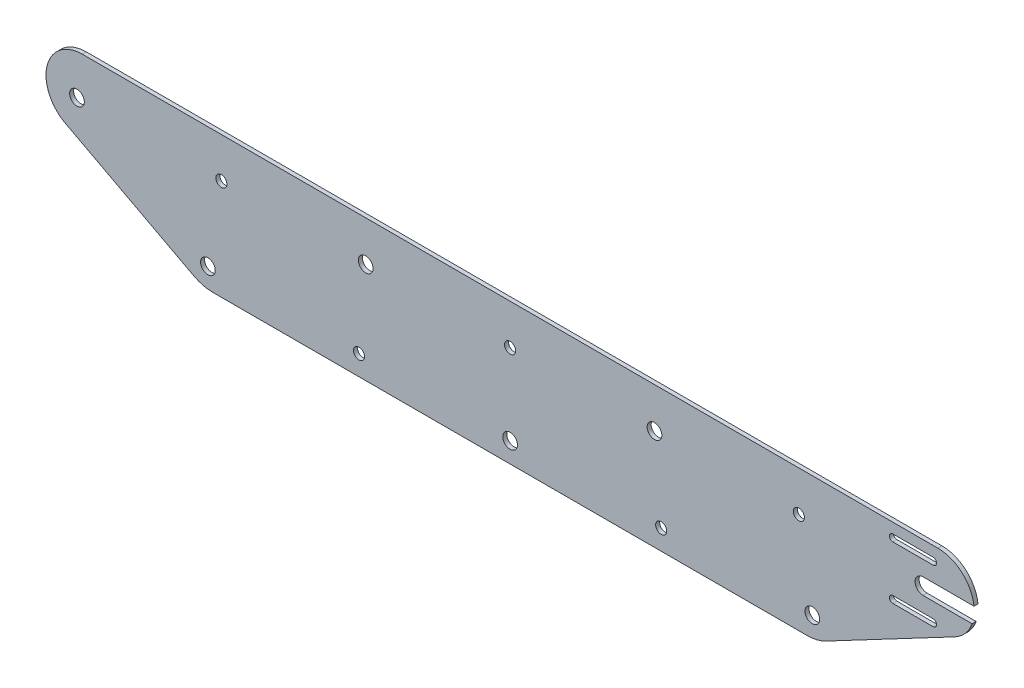
ISO-10303-21;
HEADER;
FILE_DESCRIPTION(('STEP AP214'),'2;1');
FILE_NAME('part.step','',(''),(''),'','','');
FILE_SCHEMA(('AUTOMOTIVE_DESIGN { 1 0 10303 214 1 1 1 1 }'));
ENDSEC;
DATA;
#1=APPLICATION_CONTEXT('core data for automotive mechanical design processes');
#2=APPLICATION_PROTOCOL_DEFINITION('international standard','automotive_design',2000,#1);
#3=PRODUCT_CONTEXT('',#1,'mechanical');
#4=PRODUCT('Part','Part','',(#3));
#5=PRODUCT_RELATED_PRODUCT_CATEGORY('part','',(#4));
#6=PRODUCT_DEFINITION_FORMATION('','',#4);
#7=PRODUCT_DEFINITION_CONTEXT('part definition',#1,'design');
#8=PRODUCT_DEFINITION('design','',#6,#7);
#9=PRODUCT_DEFINITION_SHAPE('','',#8);
#10=(LENGTH_UNIT() NAMED_UNIT(*) SI_UNIT(.MILLI.,.METRE.));
#11=(NAMED_UNIT(*) PLANE_ANGLE_UNIT() SI_UNIT($,.RADIAN.));
#12=(NAMED_UNIT(*) SI_UNIT($,.STERADIAN.) SOLID_ANGLE_UNIT());
#13=UNCERTAINTY_MEASURE_WITH_UNIT(LENGTH_MEASURE(1.E-05),#10,'distance_accuracy_value','');
#14=(GEOMETRIC_REPRESENTATION_CONTEXT(3) GLOBAL_UNCERTAINTY_ASSIGNED_CONTEXT((#13)) GLOBAL_UNIT_ASSIGNED_CONTEXT((#10,
#11,#12)) REPRESENTATION_CONTEXT('',''));
#15=CARTESIAN_POINT('',(0.,0.,0.));
#16=DIRECTION('',(0.,0.,1.));
#17=DIRECTION('',(1.,0.,0.));
#18=AXIS2_PLACEMENT_3D('',#15,#16,#17);
#19=CARTESIAN_POINT('',(212.363587037175,22.0000000000002,2.));
#20=DIRECTION('',(0.,0.,-1.));
#21=DIRECTION('',(-1.,0.,0.));
#22=AXIS2_PLACEMENT_3D('',#19,#20,#21);
#23=CYLINDRICAL_SURFACE('',#22,18.);
#24=CARTESIAN_POINT('',(212.363587037175,22.0000000000002,0.));
#25=DIRECTION('',(0.,0.,-1.));
#26=DIRECTION('',(-1.,0.,0.));
#27=AXIS2_PLACEMENT_3D('',#24,#25,#26);
#28=CIRCLE('',#27,18.);
#29=CARTESIAN_POINT('',(229.334149785652,16.,0.));
#30=VERTEX_POINT('',#29);
#31=CARTESIAN_POINT('',(220.772782979187,6.08505659423059,0.));
#32=VERTEX_POINT('',#31);
#33=EDGE_CURVE('E391',#30,#32,#28,.T.);
#34=ORIENTED_EDGE('',*,*,#33,.F.);
#35=DIRECTION('',(0.,0.,-1.));
#36=VECTOR('',#35,1.);
#37=CARTESIAN_POINT('',(229.334149785652,16.,2.));
#38=LINE('',#37,#36);
#39=CARTESIAN_POINT('',(229.334149785652,16.,2.));
#40=VERTEX_POINT('',#39);
#41=EDGE_CURVE('E319',#40,#30,#38,.T.);
#42=ORIENTED_EDGE('',*,*,#41,.F.);
#43=CARTESIAN_POINT('',(212.363587037175,22.0000000000002,2.));
#44=DIRECTION('',(0.,0.,-1.));
#45=DIRECTION('',(-1.,0.,0.));
#46=AXIS2_PLACEMENT_3D('',#43,#44,#45);
#47=CIRCLE('',#46,18.);
#48=CARTESIAN_POINT('',(220.772782979187,6.08505659423059,2.));
#49=VERTEX_POINT('',#48);
#50=EDGE_CURVE('E401',#49,#40,#47,.F.);
#51=ORIENTED_EDGE('',*,*,#50,.F.);
#52=DIRECTION('',(0.,0.,-1.));
#53=VECTOR('',#52,1.);
#54=CARTESIAN_POINT('',(220.772782979187,6.08505659423059,2.));
#55=LINE('',#54,#53);
#56=EDGE_CURVE('E395',#32,#49,#55,.F.);
#57=ORIENTED_EDGE('',*,*,#56,.F.);
#58=EDGE_LOOP('',(#34,#42,#51,#57));
#59=FACE_BOUND('',#58,.T.);
#60=ADVANCED_FACE('F87',(#59),#23,.T.);
#61=CARTESIAN_POINT('',(0.,0.,2.));
#62=DIRECTION('',(0.,0.,-1.));
#63=DIRECTION('',(-1.,0.,0.));
#64=AXIS2_PLACEMENT_3D('',#61,#62,#63);
#65=PLANE('',#64);
#66=CARTESIAN_POINT('',(-74.9999999999999,-20.,2.));
#67=DIRECTION('',(0.,0.,1.));
#68=DIRECTION('',(1.,0.,0.));
#69=AXIS2_PLACEMENT_3D('',#66,#67,#68);
#70=CIRCLE('',#69,2.75);
#71=CARTESIAN_POINT('',(-72.2499999999999,-20.,2.));
#72=VERTEX_POINT('',#71);
#73=EDGE_CURVE('E771',#72,#72,#70,.T.);
#74=ORIENTED_EDGE('',*,*,#73,.F.);
#75=EDGE_LOOP('',(#74));
#76=FACE_BOUND('',#75,.T.);
#77=CARTESIAN_POINT('',(75.,-20.,2.));
#78=DIRECTION('',(0.,0.,1.));
#79=DIRECTION('',(1.,0.,0.));
#80=AXIS2_PLACEMENT_3D('',#77,#78,#79);
#81=CIRCLE('',#80,2.75);
#82=CARTESIAN_POINT('',(77.75,-20.,2.));
#83=VERTEX_POINT('',#82);
#84=EDGE_CURVE('E773',#83,#83,#81,.T.);
#85=ORIENTED_EDGE('',*,*,#84,.F.);
#86=EDGE_LOOP('',(#85));
#87=FACE_BOUND('',#86,.T.);
#88=CARTESIAN_POINT('',(-143.333333333333,20.,2.));
#89=DIRECTION('',(0.,0.,-1.));
#90=DIRECTION('',(-1.,0.,0.));
#91=AXIS2_PLACEMENT_3D('',#88,#89,#90);
#92=CIRCLE('',#91,2.74999999999997);
#93=CARTESIAN_POINT('',(-146.083333333333,20.,2.));
#94=VERTEX_POINT('',#93);
#95=EDGE_CURVE('E784',#94,#94,#92,.T.);
#96=ORIENTED_EDGE('',*,*,#95,.T.);
#97=EDGE_LOOP('',(#96));
#98=FACE_BOUND('',#97,.T.);
#99=CARTESIAN_POINT('',(0.,20.,2.));
#100=DIRECTION('',(0.,0.,-1.));
#101=DIRECTION('',(-1.,0.,0.));
#102=AXIS2_PLACEMENT_3D('',#99,#100,#101);
#103=CIRCLE('',#102,2.74999999999999);
#104=CARTESIAN_POINT('',(-2.75000000000003,20.,2.));
#105=VERTEX_POINT('',#104);
#106=EDGE_CURVE('E790',#105,#105,#103,.T.);
#107=ORIENTED_EDGE('',*,*,#106,.T.);
#108=EDGE_LOOP('',(#107));
#109=FACE_BOUND('',#108,.T.);
#110=CARTESIAN_POINT('',(143.333333333333,20.,2.));
#111=DIRECTION('',(0.,0.,-1.));
#112=DIRECTION('',(-1.,0.,0.));
#113=AXIS2_PLACEMENT_3D('',#110,#111,#112);
#114=CIRCLE('',#113,2.74999999999997);
#115=CARTESIAN_POINT('',(140.583333333333,20.,2.));
#116=VERTEX_POINT('',#115);
#117=EDGE_CURVE('E253',#116,#116,#114,.T.);
#118=ORIENTED_EDGE('',*,*,#117,.T.);
#119=EDGE_LOOP('',(#118));
#120=FACE_BOUND('',#119,.T.);
#121=DIRECTION('',(-1.,0.,0.));
#122=VECTOR('',#121,1.);
#123=CARTESIAN_POINT('',(0.,5.07124344467712,2.));
#124=LINE('',#123,#122);
#125=CARTESIAN_POINT('',(210.,5.07124344467712,2.));
#126=VERTEX_POINT('',#125);
#127=CARTESIAN_POINT('',(190.,5.07124344467712,2.));
#128=VERTEX_POINT('',#127);
#129=EDGE_CURVE('E266',#126,#128,#124,.T.);
#130=ORIENTED_EDGE('',*,*,#129,.T.);
#131=CARTESIAN_POINT('',(190.,6.7712434446771,2.));
#132=DIRECTION('',(0.,0.,-1.));
#133=DIRECTION('',(-1.,0.,0.));
#134=AXIS2_PLACEMENT_3D('',#131,#132,#133);
#135=CIRCLE('',#134,1.69999999999998);
#136=CARTESIAN_POINT('',(190.,8.47124344467708,2.));
#137=VERTEX_POINT('',#136);
#138=EDGE_CURVE('E245',#137,#128,#135,.F.);
#139=ORIENTED_EDGE('',*,*,#138,.F.);
#140=DIRECTION('',(1.,0.,0.));
#141=VECTOR('',#140,1.);
#142=CARTESIAN_POINT('',(0.,8.47124344467722,2.));
#143=LINE('',#142,#141);
#144=CARTESIAN_POINT('',(210.,8.47124344467707,2.));
#145=VERTEX_POINT('',#144);
#146=EDGE_CURVE('E235',#137,#145,#143,.T.);
#147=ORIENTED_EDGE('',*,*,#146,.T.);
#148=CARTESIAN_POINT('',(210.,6.7712434446771,2.));
#149=DIRECTION('',(0.,0.,-1.));
#150=DIRECTION('',(-1.,0.,0.));
#151=AXIS2_PLACEMENT_3D('',#148,#149,#150);
#152=CIRCLE('',#151,1.69999999999998);
#153=EDGE_CURVE('E263',#145,#126,#152,.T.);
#154=ORIENTED_EDGE('',*,*,#153,.T.);
#155=EDGE_LOOP('',(#130,#139,#147,#154));
#156=FACE_BOUND('',#155,.T.);
#157=DIRECTION('',(1.,0.,0.));
#158=VECTOR('',#157,1.);
#159=CARTESIAN_POINT('',(0.,34.928756555323,2.));
#160=LINE('',#159,#158);
#161=CARTESIAN_POINT('',(190.,34.9287565553229,2.));
#162=VERTEX_POINT('',#161);
#163=CARTESIAN_POINT('',(210.,34.9287565553229,2.));
#164=VERTEX_POINT('',#163);
#165=EDGE_CURVE('E288',#162,#164,#160,.T.);
#166=ORIENTED_EDGE('',*,*,#165,.T.);
#167=CARTESIAN_POINT('',(210.,33.2287565553229,2.));
#168=DIRECTION('',(0.,0.,-1.));
#169=DIRECTION('',(-1.,0.,0.));
#170=AXIS2_PLACEMENT_3D('',#167,#168,#169);
#171=CIRCLE('',#170,1.69999999999997);
#172=CARTESIAN_POINT('',(210.,31.5287565553229,2.));
#173=VERTEX_POINT('',#172);
#174=EDGE_CURVE('E276',#164,#173,#171,.T.);
#175=ORIENTED_EDGE('',*,*,#174,.T.);
#176=DIRECTION('',(-1.,0.,0.));
#177=VECTOR('',#176,1.);
#178=CARTESIAN_POINT('',(0.,31.5287565553229,2.));
#179=LINE('',#178,#177);
#180=CARTESIAN_POINT('',(190.,31.5287565553229,2.));
#181=VERTEX_POINT('',#180);
#182=EDGE_CURVE('E291',#173,#181,#179,.T.);
#183=ORIENTED_EDGE('',*,*,#182,.T.);
#184=CARTESIAN_POINT('',(190.,33.2287565553229,2.));
#185=DIRECTION('',(0.,0.,-1.));
#186=DIRECTION('',(-1.,0.,0.));
#187=AXIS2_PLACEMENT_3D('',#184,#185,#186);
#188=CIRCLE('',#187,1.69999999999998);
#189=EDGE_CURVE('E286',#162,#181,#188,.F.);
#190=ORIENTED_EDGE('',*,*,#189,.F.);
#191=EDGE_LOOP('',(#166,#175,#183,#190));
#192=FACE_BOUND('',#191,.T.);
#193=DIRECTION('',(1.,0.,0.));
#194=VECTOR('',#193,1.);
#195=CARTESIAN_POINT('',(0.,16.0000000000001,2.));
#196=LINE('',#195,#194);
#197=CARTESIAN_POINT('',(205.,16.,2.));
#198=VERTEX_POINT('',#197);
#199=EDGE_CURVE('E305',#198,#40,#196,.T.);
#200=ORIENTED_EDGE('',*,*,#199,.F.);
#201=CARTESIAN_POINT('',(205.,20.,2.));
#202=DIRECTION('',(0.,0.,-1.));
#203=DIRECTION('',(-1.,0.,0.));
#204=AXIS2_PLACEMENT_3D('',#201,#202,#203);
#205=CIRCLE('',#204,4.00000000000001);
#206=CARTESIAN_POINT('',(205.,24.,2.));
#207=VERTEX_POINT('',#206);
#208=EDGE_CURVE('E307',#207,#198,#205,.F.);
#209=ORIENTED_EDGE('',*,*,#208,.F.);
#210=DIRECTION('',(1.,0.,0.));
#211=VECTOR('',#210,1.);
#212=CARTESIAN_POINT('',(0.,24.,2.));
#213=LINE('',#212,#211);
#214=CARTESIAN_POINT('',(230.252130857173,24.,2.));
#215=VERTEX_POINT('',#214);
#216=EDGE_CURVE('E309',#207,#215,#213,.T.);
#217=ORIENTED_EDGE('',*,*,#216,.T.);
#218=CARTESIAN_POINT('',(212.363587037175,40.0000000000001,2.));
#219=VERTEX_POINT('',#218);
#220=EDGE_CURVE('E400',#215,#219,#47,.F.);
#221=ORIENTED_EDGE('',*,*,#220,.T.);
#222=DIRECTION('',(-1.,0.,0.));
#223=VECTOR('',#222,1.);
#224=CARTESIAN_POINT('',(150.,40.0000000000001,2.));
#225=LINE('',#224,#223);
#226=CARTESIAN_POINT('',(-212.363587037174,40.0000000000004,2.));
#227=VERTEX_POINT('',#226);
#228=EDGE_CURVE('E371',#219,#227,#225,.T.);
#229=ORIENTED_EDGE('',*,*,#228,.T.);
#230=CARTESIAN_POINT('',(-212.363587037174,22.,2.));
#231=DIRECTION('',(0.,0.,-1.));
#232=DIRECTION('',(-1.,0.,0.));
#233=AXIS2_PLACEMENT_3D('',#230,#231,#232);
#234=CIRCLE('',#233,18.);
#235=CARTESIAN_POINT('',(-220.772782979187,6.08505659423048,2.));
#236=VERTEX_POINT('',#235);
#237=EDGE_CURVE('E398',#227,#236,#234,.F.);
#238=ORIENTED_EDGE('',*,*,#237,.T.);
#239=DIRECTION('',(0.884163522542753,-0.467177552334003,0.));
#240=VECTOR('',#239,1.);
#241=CARTESIAN_POINT('',(-284.958991581617,40.,2.));
#242=LINE('',#241,#240);
#243=CARTESIAN_POINT('',(-156.864055255872,-27.6832704508551,2.));
#244=VERTEX_POINT('',#243);
#245=EDGE_CURVE('E363',#236,#244,#242,.T.);
#246=ORIENTED_EDGE('',*,*,#245,.T.);
#247=CARTESIAN_POINT('',(-147.520504209191,-10.,2.));
#248=DIRECTION('',(0.,0.,-1.));
#249=DIRECTION('',(-1.,0.,0.));
#250=AXIS2_PLACEMENT_3D('',#247,#248,#249);
#251=CIRCLE('',#250,20.);
#252=CARTESIAN_POINT('',(-147.520504209191,-30.,2.));
#253=VERTEX_POINT('',#252);
#254=EDGE_CURVE('E95',#244,#253,#251,.F.);
#255=ORIENTED_EDGE('',*,*,#254,.T.);
#256=DIRECTION('',(1.,0.,0.));
#257=VECTOR('',#256,1.);
#258=CARTESIAN_POINT('',(-152.479495790809,-30.,2.));
#259=LINE('',#258,#257);
#260=CARTESIAN_POINT('',(147.520504209191,-30.,2.));
#261=VERTEX_POINT('',#260);
#262=EDGE_CURVE('E366',#253,#261,#259,.T.);
#263=ORIENTED_EDGE('',*,*,#262,.T.);
#264=CARTESIAN_POINT('',(147.520504209191,-9.99999999999999,2.));
#265=DIRECTION('',(0.,0.,-1.));
#266=DIRECTION('',(-1.,0.,0.));
#267=AXIS2_PLACEMENT_3D('',#264,#265,#266);
#268=CIRCLE('',#267,20.);
#269=CARTESIAN_POINT('',(156.864055255872,-27.6832704508551,2.));
#270=VERTEX_POINT('',#269);
#271=EDGE_CURVE('E110',#261,#270,#268,.F.);
#272=ORIENTED_EDGE('',*,*,#271,.T.);
#273=DIRECTION('',(0.884163522542753,0.467177552334003,0.));
#274=VECTOR('',#273,1.);
#275=CARTESIAN_POINT('',(284.958991581617,40.,2.));
#276=LINE('',#275,#274);
#277=EDGE_CURVE('E369',#270,#49,#276,.T.);
#278=ORIENTED_EDGE('',*,*,#277,.T.);
#279=ORIENTED_EDGE('',*,*,#50,.T.);
#280=EDGE_LOOP('',(#200,#209,#217,#221,#229,#238,#246,#255,#263,#272,#278,#279));
#281=FACE_BOUND('',#280,.T.);
#282=CARTESIAN_POINT('',(0.,-20.,2.));
#283=DIRECTION('',(0.,0.,1.));
#284=DIRECTION('',(1.,0.,0.));
#285=AXIS2_PLACEMENT_3D('',#282,#283,#284);
#286=CIRCLE('',#285,3.65);
#287=CARTESIAN_POINT('',(3.65000000000003,-20.,2.));
#288=VERTEX_POINT('',#287);
#289=EDGE_CURVE('E357',#288,#288,#286,.T.);
#290=ORIENTED_EDGE('',*,*,#289,.F.);
#291=EDGE_LOOP('',(#290));
#292=FACE_BOUND('',#291,.T.);
#293=CARTESIAN_POINT('',(-215.,20.,2.));
#294=DIRECTION('',(0.,0.,1.));
#295=DIRECTION('',(1.,0.,0.));
#296=AXIS2_PLACEMENT_3D('',#293,#294,#295);
#297=CIRCLE('',#296,3.64999999999998);
#298=CARTESIAN_POINT('',(-211.35,20.,2.));
#299=VERTEX_POINT('',#298);
#300=EDGE_CURVE('E351',#299,#299,#297,.T.);
#301=ORIENTED_EDGE('',*,*,#300,.F.);
#302=EDGE_LOOP('',(#301));
#303=FACE_BOUND('',#302,.T.);
#304=CARTESIAN_POINT('',(-150.,-20.,2.));
#305=DIRECTION('',(0.,0.,1.));
#306=DIRECTION('',(1.,0.,0.));
#307=AXIS2_PLACEMENT_3D('',#304,#305,#306);
#308=CIRCLE('',#307,3.64999999999998);
#309=CARTESIAN_POINT('',(-146.35,-20.,2.));
#310=VERTEX_POINT('',#309);
#311=EDGE_CURVE('E345',#310,#310,#308,.T.);
#312=ORIENTED_EDGE('',*,*,#311,.F.);
#313=EDGE_LOOP('',(#312));
#314=FACE_BOUND('',#313,.T.);
#315=CARTESIAN_POINT('',(150.,-20.,2.));
#316=DIRECTION('',(0.,0.,1.));
#317=DIRECTION('',(1.,0.,0.));
#318=AXIS2_PLACEMENT_3D('',#315,#316,#317);
#319=CIRCLE('',#318,3.64999999999998);
#320=CARTESIAN_POINT('',(153.65,-20.,2.));
#321=VERTEX_POINT('',#320);
#322=EDGE_CURVE('E339',#321,#321,#319,.T.);
#323=ORIENTED_EDGE('',*,*,#322,.F.);
#324=EDGE_LOOP('',(#323));
#325=FACE_BOUND('',#324,.T.);
#326=CARTESIAN_POINT('',(-71.6666666666667,20.,2.));
#327=DIRECTION('',(0.,0.,1.));
#328=DIRECTION('',(1.,0.,0.));
#329=AXIS2_PLACEMENT_3D('',#326,#327,#328);
#330=CIRCLE('',#329,3.65);
#331=CARTESIAN_POINT('',(-68.0166666666667,20.,2.));
#332=VERTEX_POINT('',#331);
#333=EDGE_CURVE('E333',#332,#332,#330,.T.);
#334=ORIENTED_EDGE('',*,*,#333,.F.);
#335=EDGE_LOOP('',(#334));
#336=FACE_BOUND('',#335,.T.);
#337=CARTESIAN_POINT('',(71.6666666666666,20.,2.));
#338=DIRECTION('',(0.,0.,1.));
#339=DIRECTION('',(1.,0.,0.));
#340=AXIS2_PLACEMENT_3D('',#337,#338,#339);
#341=CIRCLE('',#340,3.65);
#342=CARTESIAN_POINT('',(75.3166666666666,20.,2.));
#343=VERTEX_POINT('',#342);
#344=EDGE_CURVE('E327',#343,#343,#341,.T.);
#345=ORIENTED_EDGE('',*,*,#344,.F.);
#346=EDGE_LOOP('',(#345));
#347=FACE_BOUND('',#346,.T.);
#348=ADVANCED_FACE('F421',(#76,#87,#98,#109,#120,#156,#192,#281,#292,#303,#314,#325,#336,#347),
#65,.F.);
#349=CARTESIAN_POINT('',(0.,0.,0.));
#350=DIRECTION('',(0.,0.,-1.));
#351=DIRECTION('',(-1.,0.,0.));
#352=AXIS2_PLACEMENT_3D('',#349,#350,#351);
#353=PLANE('',#352);
#354=CARTESIAN_POINT('',(-74.9999999999999,-20.,0.));
#355=DIRECTION('',(0.,0.,1.));
#356=DIRECTION('',(1.,0.,0.));
#357=AXIS2_PLACEMENT_3D('',#354,#355,#356);
#358=CIRCLE('',#357,2.75);
#359=CARTESIAN_POINT('',(-72.2499999999999,-20.,0.));
#360=VERTEX_POINT('',#359);
#361=EDGE_CURVE('E768',#360,#360,#358,.T.);
#362=ORIENTED_EDGE('',*,*,#361,.T.);
#363=EDGE_LOOP('',(#362));
#364=FACE_BOUND('',#363,.T.);
#365=CARTESIAN_POINT('',(75.,-20.,0.));
#366=DIRECTION('',(0.,0.,1.));
#367=DIRECTION('',(1.,0.,0.));
#368=AXIS2_PLACEMENT_3D('',#365,#366,#367);
#369=CIRCLE('',#368,2.75);
#370=CARTESIAN_POINT('',(77.75,-20.,0.));
#371=VERTEX_POINT('',#370);
#372=EDGE_CURVE('E778',#371,#371,#369,.T.);
#373=ORIENTED_EDGE('',*,*,#372,.T.);
#374=EDGE_LOOP('',(#373));
#375=FACE_BOUND('',#374,.T.);
#376=CARTESIAN_POINT('',(-143.333333333333,20.,0.));
#377=DIRECTION('',(0.,0.,-1.));
#378=DIRECTION('',(-1.,0.,0.));
#379=AXIS2_PLACEMENT_3D('',#376,#377,#378);
#380=CIRCLE('',#379,2.74999999999997);
#381=CARTESIAN_POINT('',(-146.083333333333,20.,0.));
#382=VERTEX_POINT('',#381);
#383=EDGE_CURVE('E781',#382,#382,#380,.T.);
#384=ORIENTED_EDGE('',*,*,#383,.F.);
#385=EDGE_LOOP('',(#384));
#386=FACE_BOUND('',#385,.T.);
#387=CARTESIAN_POINT('',(0.,20.,0.));
#388=DIRECTION('',(0.,0.,-1.));
#389=DIRECTION('',(-1.,0.,0.));
#390=AXIS2_PLACEMENT_3D('',#387,#388,#389);
#391=CIRCLE('',#390,2.74999999999999);
#392=CARTESIAN_POINT('',(-2.75000000000003,20.,0.));
#393=VERTEX_POINT('',#392);
#394=EDGE_CURVE('E787',#393,#393,#391,.T.);
#395=ORIENTED_EDGE('',*,*,#394,.F.);
#396=EDGE_LOOP('',(#395));
#397=FACE_BOUND('',#396,.T.);
#398=CARTESIAN_POINT('',(143.333333333333,20.,0.));
#399=DIRECTION('',(0.,0.,-1.));
#400=DIRECTION('',(-1.,0.,0.));
#401=AXIS2_PLACEMENT_3D('',#398,#399,#400);
#402=CIRCLE('',#401,2.74999999999997);
#403=CARTESIAN_POINT('',(140.583333333333,20.,0.));
#404=VERTEX_POINT('',#403);
#405=EDGE_CURVE('E257',#404,#404,#402,.T.);
#406=ORIENTED_EDGE('',*,*,#405,.F.);
#407=EDGE_LOOP('',(#406));
#408=FACE_BOUND('',#407,.T.);
#409=CARTESIAN_POINT('',(190.,6.7712434446771,0.));
#410=DIRECTION('',(0.,0.,-1.));
#411=DIRECTION('',(-1.,0.,0.));
#412=AXIS2_PLACEMENT_3D('',#409,#410,#411);
#413=CIRCLE('',#412,1.69999999999998);
#414=CARTESIAN_POINT('',(190.,8.47124344467708,0.));
#415=VERTEX_POINT('',#414);
#416=CARTESIAN_POINT('',(190.,5.07124344467712,0.));
#417=VERTEX_POINT('',#416);
#418=EDGE_CURVE('E243',#415,#417,#413,.F.);
#419=ORIENTED_EDGE('',*,*,#418,.T.);
#420=DIRECTION('',(-1.,0.,0.));
#421=VECTOR('',#420,1.);
#422=CARTESIAN_POINT('',(0.,5.07124344467712,0.));
#423=LINE('',#422,#421);
#424=CARTESIAN_POINT('',(210.,5.07124344467712,0.));
#425=VERTEX_POINT('',#424);
#426=EDGE_CURVE('E225',#425,#417,#423,.T.);
#427=ORIENTED_EDGE('',*,*,#426,.F.);
#428=CARTESIAN_POINT('',(210.,6.7712434446771,0.));
#429=DIRECTION('',(0.,0.,-1.));
#430=DIRECTION('',(-1.,0.,0.));
#431=AXIS2_PLACEMENT_3D('',#428,#429,#430);
#432=CIRCLE('',#431,1.69999999999998);
#433=CARTESIAN_POINT('',(210.,8.47124344467707,0.));
#434=VERTEX_POINT('',#433);
#435=EDGE_CURVE('E236',#434,#425,#432,.T.);
#436=ORIENTED_EDGE('',*,*,#435,.F.);
#437=DIRECTION('',(1.,0.,0.));
#438=VECTOR('',#437,1.);
#439=CARTESIAN_POINT('',(0.,8.47124344467722,0.));
#440=LINE('',#439,#438);
#441=EDGE_CURVE('E251',#415,#434,#440,.T.);
#442=ORIENTED_EDGE('',*,*,#441,.F.);
#443=EDGE_LOOP('',(#419,#427,#436,#442));
#444=FACE_BOUND('',#443,.T.);
#445=CARTESIAN_POINT('',(210.,33.2287565553229,0.));
#446=DIRECTION('',(0.,0.,-1.));
#447=DIRECTION('',(-1.,0.,0.));
#448=AXIS2_PLACEMENT_3D('',#445,#446,#447);
#449=CIRCLE('',#448,1.69999999999997);
#450=CARTESIAN_POINT('',(210.,34.9287565553229,0.));
#451=VERTEX_POINT('',#450);
#452=CARTESIAN_POINT('',(210.,31.5287565553229,0.));
#453=VERTEX_POINT('',#452);
#454=EDGE_CURVE('E280',#451,#453,#449,.T.);
#455=ORIENTED_EDGE('',*,*,#454,.F.);
#456=DIRECTION('',(1.,0.,0.));
#457=VECTOR('',#456,1.);
#458=CARTESIAN_POINT('',(0.,34.928756555323,0.));
#459=LINE('',#458,#457);
#460=CARTESIAN_POINT('',(190.,34.9287565553229,0.));
#461=VERTEX_POINT('',#460);
#462=EDGE_CURVE('E297',#461,#451,#459,.T.);
#463=ORIENTED_EDGE('',*,*,#462,.F.);
#464=CARTESIAN_POINT('',(190.,33.2287565553229,0.));
#465=DIRECTION('',(0.,0.,-1.));
#466=DIRECTION('',(-1.,0.,0.));
#467=AXIS2_PLACEMENT_3D('',#464,#465,#466);
#468=CIRCLE('',#467,1.69999999999998);
#469=CARTESIAN_POINT('',(190.,31.5287565553229,0.));
#470=VERTEX_POINT('',#469);
#471=EDGE_CURVE('E283',#461,#470,#468,.F.);
#472=ORIENTED_EDGE('',*,*,#471,.T.);
#473=DIRECTION('',(-1.,0.,0.));
#474=VECTOR('',#473,1.);
#475=CARTESIAN_POINT('',(0.,31.5287565553229,0.));
#476=LINE('',#475,#474);
#477=EDGE_CURVE('E289',#453,#470,#476,.T.);
#478=ORIENTED_EDGE('',*,*,#477,.F.);
#479=EDGE_LOOP('',(#455,#463,#472,#478));
#480=FACE_BOUND('',#479,.T.);
#481=CARTESIAN_POINT('',(205.,20.,0.));
#482=DIRECTION('',(0.,0.,-1.));
#483=DIRECTION('',(-1.,0.,0.));
#484=AXIS2_PLACEMENT_3D('',#481,#482,#483);
#485=CIRCLE('',#484,4.00000000000001);
#486=CARTESIAN_POINT('',(205.,24.,0.));
#487=VERTEX_POINT('',#486);
#488=CARTESIAN_POINT('',(205.,16.,0.));
#489=VERTEX_POINT('',#488);
#490=EDGE_CURVE('E315',#487,#489,#485,.F.);
#491=ORIENTED_EDGE('',*,*,#490,.T.);
#492=DIRECTION('',(1.,0.,0.));
#493=VECTOR('',#492,1.);
#494=CARTESIAN_POINT('',(0.,16.0000000000001,0.));
#495=LINE('',#494,#493);
#496=EDGE_CURVE('E303',#489,#30,#495,.T.);
#497=ORIENTED_EDGE('',*,*,#496,.T.);
#498=ORIENTED_EDGE('',*,*,#33,.T.);
#499=DIRECTION('',(0.884163522542753,0.467177552334003,0.));
#500=VECTOR('',#499,1.);
#501=CARTESIAN_POINT('',(284.958991581617,40.,0.));
#502=LINE('',#501,#500);
#503=CARTESIAN_POINT('',(156.864055255872,-27.6832704508551,0.));
#504=VERTEX_POINT('',#503);
#505=EDGE_CURVE('E380',#504,#32,#502,.T.);
#506=ORIENTED_EDGE('',*,*,#505,.F.);
#507=CARTESIAN_POINT('',(147.520504209191,-9.99999999999999,0.));
#508=DIRECTION('',(0.,0.,-1.));
#509=DIRECTION('',(-1.,0.,0.));
#510=AXIS2_PLACEMENT_3D('',#507,#508,#509);
#511=CIRCLE('',#510,20.);
#512=CARTESIAN_POINT('',(147.520504209191,-30.,0.));
#513=VERTEX_POINT('',#512);
#514=EDGE_CURVE('E412',#504,#513,#511,.T.);
#515=ORIENTED_EDGE('',*,*,#514,.T.);
#516=DIRECTION('',(1.,0.,0.));
#517=VECTOR('',#516,1.);
#518=CARTESIAN_POINT('',(-152.479495790809,-30.,0.));
#519=LINE('',#518,#517);
#520=CARTESIAN_POINT('',(-147.520504209191,-30.,0.));
#521=VERTEX_POINT('',#520);
#522=EDGE_CURVE('E377',#521,#513,#519,.T.);
#523=ORIENTED_EDGE('',*,*,#522,.F.);
#524=CARTESIAN_POINT('',(-147.520504209191,-10.,0.));
#525=DIRECTION('',(0.,0.,-1.));
#526=DIRECTION('',(-1.,0.,0.));
#527=AXIS2_PLACEMENT_3D('',#524,#525,#526);
#528=CIRCLE('',#527,20.);
#529=CARTESIAN_POINT('',(-156.864055255872,-27.6832704508551,0.));
#530=VERTEX_POINT('',#529);
#531=EDGE_CURVE('E414',#521,#530,#528,.T.);
#532=ORIENTED_EDGE('',*,*,#531,.T.);
#533=DIRECTION('',(0.884163522542753,-0.467177552334003,0.));
#534=VECTOR('',#533,1.);
#535=CARTESIAN_POINT('',(-284.958991581617,40.,0.));
#536=LINE('',#535,#534);
#537=CARTESIAN_POINT('',(-220.772782979187,6.08505659423048,0.));
#538=VERTEX_POINT('',#537);
#539=EDGE_CURVE('E360',#538,#530,#536,.T.);
#540=ORIENTED_EDGE('',*,*,#539,.F.);
#541=CARTESIAN_POINT('',(-212.363587037174,22.,0.));
#542=DIRECTION('',(0.,0.,-1.));
#543=DIRECTION('',(-1.,0.,0.));
#544=AXIS2_PLACEMENT_3D('',#541,#542,#543);
#545=CIRCLE('',#544,18.);
#546=CARTESIAN_POINT('',(-212.363587037174,40.,0.));
#547=VERTEX_POINT('',#546);
#548=EDGE_CURVE('E389',#538,#547,#545,.T.);
#549=ORIENTED_EDGE('',*,*,#548,.T.);
#550=DIRECTION('',(-1.,0.,0.));
#551=VECTOR('',#550,1.);
#552=CARTESIAN_POINT('',(-284.958991581617,40.,0.));
#553=LINE('',#552,#551);
#554=CARTESIAN_POINT('',(212.363587037175,40.0000000000002,0.));
#555=VERTEX_POINT('',#554);
#556=EDGE_CURVE('E367',#555,#547,#553,.T.);
#557=ORIENTED_EDGE('',*,*,#556,.F.);
#558=CARTESIAN_POINT('',(230.252130857173,24.,0.));
#559=VERTEX_POINT('',#558);
#560=EDGE_CURVE('E392',#555,#559,#28,.T.);
#561=ORIENTED_EDGE('',*,*,#560,.T.);
#562=DIRECTION('',(1.,0.,0.));
#563=VECTOR('',#562,1.);
#564=CARTESIAN_POINT('',(0.,24.,0.));
#565=LINE('',#564,#563);
#566=EDGE_CURVE('E102',#487,#559,#565,.T.);
#567=ORIENTED_EDGE('',*,*,#566,.F.);
#568=EDGE_LOOP('',(#491,#497,#498,#506,#515,#523,#532,#540,#549,#557,#561,#567));
#569=FACE_BOUND('',#568,.T.);
#570=CARTESIAN_POINT('',(-71.6666666666667,20.,0.));
#571=DIRECTION('',(0.,0.,1.));
#572=DIRECTION('',(1.,0.,0.));
#573=AXIS2_PLACEMENT_3D('',#570,#571,#572);
#574=CIRCLE('',#573,3.65);
#575=CARTESIAN_POINT('',(-68.0166666666667,20.,0.));
#576=VERTEX_POINT('',#575);
#577=EDGE_CURVE('E330',#576,#576,#574,.T.);
#578=ORIENTED_EDGE('',*,*,#577,.T.);
#579=EDGE_LOOP('',(#578));
#580=FACE_BOUND('',#579,.T.);
#581=CARTESIAN_POINT('',(150.,-20.,0.));
#582=DIRECTION('',(0.,0.,1.));
#583=DIRECTION('',(1.,0.,0.));
#584=AXIS2_PLACEMENT_3D('',#581,#582,#583);
#585=CIRCLE('',#584,3.64999999999998);
#586=CARTESIAN_POINT('',(153.65,-20.,0.));
#587=VERTEX_POINT('',#586);
#588=EDGE_CURVE('E336',#587,#587,#585,.T.);
#589=ORIENTED_EDGE('',*,*,#588,.T.);
#590=EDGE_LOOP('',(#589));
#591=FACE_BOUND('',#590,.T.);
#592=CARTESIAN_POINT('',(-215.,20.,0.));
#593=DIRECTION('',(0.,0.,1.));
#594=DIRECTION('',(1.,0.,0.));
#595=AXIS2_PLACEMENT_3D('',#592,#593,#594);
#596=CIRCLE('',#595,3.64999999999998);
#597=CARTESIAN_POINT('',(-211.35,20.,0.));
#598=VERTEX_POINT('',#597);
#599=EDGE_CURVE('E348',#598,#598,#596,.T.);
#600=ORIENTED_EDGE('',*,*,#599,.T.);
#601=EDGE_LOOP('',(#600));
#602=FACE_BOUND('',#601,.T.);
#603=CARTESIAN_POINT('',(0.,-20.,0.));
#604=DIRECTION('',(0.,0.,1.));
#605=DIRECTION('',(1.,0.,0.));
#606=AXIS2_PLACEMENT_3D('',#603,#604,#605);
#607=CIRCLE('',#606,3.65);
#608=CARTESIAN_POINT('',(3.65000000000003,-20.,0.));
#609=VERTEX_POINT('',#608);
#610=EDGE_CURVE('E354',#609,#609,#607,.T.);
#611=ORIENTED_EDGE('',*,*,#610,.T.);
#612=EDGE_LOOP('',(#611));
#613=FACE_BOUND('',#612,.T.);
#614=CARTESIAN_POINT('',(-150.,-20.,0.));
#615=DIRECTION('',(0.,0.,1.));
#616=DIRECTION('',(1.,0.,0.));
#617=AXIS2_PLACEMENT_3D('',#614,#615,#616);
#618=CIRCLE('',#617,3.64999999999998);
#619=CARTESIAN_POINT('',(-146.35,-20.,0.));
#620=VERTEX_POINT('',#619);
#621=EDGE_CURVE('E342',#620,#620,#618,.T.);
#622=ORIENTED_EDGE('',*,*,#621,.T.);
#623=EDGE_LOOP('',(#622));
#624=FACE_BOUND('',#623,.T.);
#625=CARTESIAN_POINT('',(71.6666666666666,20.,0.));
#626=DIRECTION('',(0.,0.,1.));
#627=DIRECTION('',(1.,0.,0.));
#628=AXIS2_PLACEMENT_3D('',#625,#626,#627);
#629=CIRCLE('',#628,3.65);
#630=CARTESIAN_POINT('',(75.3166666666666,20.,0.));
#631=VERTEX_POINT('',#630);
#632=EDGE_CURVE('E321',#631,#631,#629,.T.);
#633=ORIENTED_EDGE('',*,*,#632,.T.);
#634=EDGE_LOOP('',(#633));
#635=FACE_BOUND('',#634,.T.);
#636=ADVANCED_FACE('F248',(#364,#375,#386,#397,#408,#444,#480,#569,#580,#591,#602,#613,#624,
#635),#353,.T.);
#637=CARTESIAN_POINT('',(-284.958991581617,40.,2.));
#638=DIRECTION('',(0.467177552334003,0.884163522542753,0.));
#639=DIRECTION('',(-0.884163522542753,0.467177552334003,0.));
#640=AXIS2_PLACEMENT_3D('',#637,#638,#639);
#641=PLANE('',#640);
#642=ORIENTED_EDGE('',*,*,#539,.T.);
#643=DIRECTION('',(0.,0.,-1.));
#644=VECTOR('',#643,1.);
#645=CARTESIAN_POINT('',(-156.864055255872,-27.6832704508551,2.));
#646=LINE('',#645,#644);
#647=EDGE_CURVE('E416',#530,#244,#646,.F.);
#648=ORIENTED_EDGE('',*,*,#647,.T.);
#649=ORIENTED_EDGE('',*,*,#245,.F.);
#650=DIRECTION('',(0.,0.,-1.));
#651=VECTOR('',#650,1.);
#652=CARTESIAN_POINT('',(-220.772782979187,6.08505659423048,2.));
#653=LINE('',#652,#651);
#654=EDGE_CURVE('E404',#236,#538,#653,.T.);
#655=ORIENTED_EDGE('',*,*,#654,.T.);
#656=EDGE_LOOP('',(#642,#648,#649,#655));
#657=FACE_BOUND('',#656,.T.);
#658=ADVANCED_FACE('F436',(#657),#641,.F.);
#659=CARTESIAN_POINT('',(-152.479495790809,-30.,2.));
#660=DIRECTION('',(0.,1.,0.));
#661=DIRECTION('',(0.,0.,1.));
#662=AXIS2_PLACEMENT_3D('',#659,#660,#661);
#663=PLANE('',#662);
#664=ORIENTED_EDGE('',*,*,#262,.F.);
#665=DIRECTION('',(0.,0.,-1.));
#666=VECTOR('',#665,1.);
#667=CARTESIAN_POINT('',(-147.520504209191,-30.,2.));
#668=LINE('',#667,#666);
#669=EDGE_CURVE('E409',#253,#521,#668,.T.);
#670=ORIENTED_EDGE('',*,*,#669,.T.);
#671=ORIENTED_EDGE('',*,*,#522,.T.);
#672=DIRECTION('',(0.,0.,-1.));
#673=VECTOR('',#672,1.);
#674=CARTESIAN_POINT('',(147.520504209191,-30.,2.));
#675=LINE('',#674,#673);
#676=EDGE_CURVE('E407',#513,#261,#675,.F.);
#677=ORIENTED_EDGE('',*,*,#676,.T.);
#678=EDGE_LOOP('',(#664,#670,#671,#677));
#679=FACE_BOUND('',#678,.T.);
#680=ADVANCED_FACE('F428',(#679),#663,.F.);
#681=CARTESIAN_POINT('',(284.958991581617,40.,2.));
#682=DIRECTION('',(-0.467177552334003,0.884163522542753,0.));
#683=DIRECTION('',(-0.884163522542753,-0.467177552334003,0.));
#684=AXIS2_PLACEMENT_3D('',#681,#682,#683);
#685=PLANE('',#684);
#686=ORIENTED_EDGE('',*,*,#277,.F.);
#687=DIRECTION('',(0.,0.,-1.));
#688=VECTOR('',#687,1.);
#689=CARTESIAN_POINT('',(156.864055255872,-27.6832704508551,2.));
#690=LINE('',#689,#688);
#691=EDGE_CURVE('E12',#270,#504,#690,.T.);
#692=ORIENTED_EDGE('',*,*,#691,.T.);
#693=ORIENTED_EDGE('',*,*,#505,.T.);
#694=ORIENTED_EDGE('',*,*,#56,.T.);
#695=EDGE_LOOP('',(#686,#692,#693,#694));
#696=FACE_BOUND('',#695,.T.);
#697=ADVANCED_FACE('F466',(#696),#685,.F.);
#698=CARTESIAN_POINT('',(-284.958991581617,40.,2.));
#699=DIRECTION('',(0.,-1.,0.));
#700=DIRECTION('',(1.,0.,0.));
#701=AXIS2_PLACEMENT_3D('',#698,#699,#700);
#702=PLANE('',#701);
#703=ORIENTED_EDGE('',*,*,#228,.F.);
#704=DIRECTION('',(0.,0.,-1.));
#705=VECTOR('',#704,1.);
#706=CARTESIAN_POINT('',(212.363587037175,40.0000000000002,2.));
#707=LINE('',#706,#705);
#708=EDGE_CURVE('E386',#219,#555,#707,.T.);
#709=ORIENTED_EDGE('',*,*,#708,.T.);
#710=ORIENTED_EDGE('',*,*,#556,.T.);
#711=DIRECTION('',(0.,0.,-1.));
#712=VECTOR('',#711,1.);
#713=CARTESIAN_POINT('',(-212.363587037174,40.,2.));
#714=LINE('',#713,#712);
#715=EDGE_CURVE('E374',#547,#227,#714,.F.);
#716=ORIENTED_EDGE('',*,*,#715,.T.);
#717=EDGE_LOOP('',(#703,#709,#710,#716));
#718=FACE_BOUND('',#717,.T.);
#719=ADVANCED_FACE('F445',(#718),#702,.F.);
#720=CARTESIAN_POINT('',(0.,-20.,2.));
#721=DIRECTION('',(0.,0.,-1.));
#722=DIRECTION('',(-1.,0.,0.));
#723=AXIS2_PLACEMENT_3D('',#720,#721,#722);
#724=CYLINDRICAL_SURFACE('',#723,3.65);
#725=ORIENTED_EDGE('',*,*,#289,.T.);
#726=EDGE_LOOP('',(#725));
#727=FACE_BOUND('',#726,.T.);
#728=ORIENTED_EDGE('',*,*,#610,.F.);
#729=EDGE_LOOP('',(#728));
#730=FACE_BOUND('',#729,.T.);
#731=ADVANCED_FACE('F513',(#727,#730),#724,.F.);
#732=CARTESIAN_POINT('',(-215.,20.,2.));
#733=DIRECTION('',(0.,0.,-1.));
#734=DIRECTION('',(-1.,0.,0.));
#735=AXIS2_PLACEMENT_3D('',#732,#733,#734);
#736=CYLINDRICAL_SURFACE('',#735,3.64999999999998);
#737=ORIENTED_EDGE('',*,*,#300,.T.);
#738=EDGE_LOOP('',(#737));
#739=FACE_BOUND('',#738,.T.);
#740=ORIENTED_EDGE('',*,*,#599,.F.);
#741=EDGE_LOOP('',(#740));
#742=FACE_BOUND('',#741,.T.);
#743=ADVANCED_FACE('F509',(#739,#742),#736,.F.);
#744=CARTESIAN_POINT('',(-150.,-20.,2.));
#745=DIRECTION('',(0.,0.,-1.));
#746=DIRECTION('',(-1.,0.,0.));
#747=AXIS2_PLACEMENT_3D('',#744,#745,#746);
#748=CYLINDRICAL_SURFACE('',#747,3.64999999999998);
#749=ORIENTED_EDGE('',*,*,#311,.T.);
#750=EDGE_LOOP('',(#749));
#751=FACE_BOUND('',#750,.T.);
#752=ORIENTED_EDGE('',*,*,#621,.F.);
#753=EDGE_LOOP('',(#752));
#754=FACE_BOUND('',#753,.T.);
#755=ADVANCED_FACE('F505',(#751,#754),#748,.F.);
#756=CARTESIAN_POINT('',(150.,-20.,2.));
#757=DIRECTION('',(0.,0.,-1.));
#758=DIRECTION('',(-1.,0.,0.));
#759=AXIS2_PLACEMENT_3D('',#756,#757,#758);
#760=CYLINDRICAL_SURFACE('',#759,3.64999999999998);
#761=ORIENTED_EDGE('',*,*,#322,.T.);
#762=EDGE_LOOP('',(#761));
#763=FACE_BOUND('',#762,.T.);
#764=ORIENTED_EDGE('',*,*,#588,.F.);
#765=EDGE_LOOP('',(#764));
#766=FACE_BOUND('',#765,.T.);
#767=ADVANCED_FACE('F497',(#763,#766),#760,.F.);
#768=CARTESIAN_POINT('',(-71.6666666666667,20.,2.));
#769=DIRECTION('',(0.,0.,-1.));
#770=DIRECTION('',(-1.,0.,0.));
#771=AXIS2_PLACEMENT_3D('',#768,#769,#770);
#772=CYLINDRICAL_SURFACE('',#771,3.65);
#773=ORIENTED_EDGE('',*,*,#333,.T.);
#774=EDGE_LOOP('',(#773));
#775=FACE_BOUND('',#774,.T.);
#776=ORIENTED_EDGE('',*,*,#577,.F.);
#777=EDGE_LOOP('',(#776));
#778=FACE_BOUND('',#777,.T.);
#779=ADVANCED_FACE('F491',(#775,#778),#772,.F.);
#780=CARTESIAN_POINT('',(71.6666666666666,20.,2.));
#781=DIRECTION('',(0.,0.,-1.));
#782=DIRECTION('',(-1.,0.,0.));
#783=AXIS2_PLACEMENT_3D('',#780,#781,#782);
#784=CYLINDRICAL_SURFACE('',#783,3.65);
#785=ORIENTED_EDGE('',*,*,#344,.T.);
#786=EDGE_LOOP('',(#785));
#787=FACE_BOUND('',#786,.T.);
#788=ORIENTED_EDGE('',*,*,#632,.F.);
#789=EDGE_LOOP('',(#788));
#790=FACE_BOUND('',#789,.T.);
#791=ADVANCED_FACE('F486',(#787,#790),#784,.F.);
#792=DIRECTION('',(0.,0.,-1.));
#793=VECTOR('',#792,1.);
#794=CARTESIAN_POINT('',(230.252130857173,24.,2.));
#795=LINE('',#794,#793);
#796=EDGE_CURVE('E322',#215,#559,#795,.T.);
#797=ORIENTED_EDGE('',*,*,#796,.T.);
#798=ORIENTED_EDGE('',*,*,#560,.F.);
#799=ORIENTED_EDGE('',*,*,#708,.F.);
#800=ORIENTED_EDGE('',*,*,#220,.F.);
#801=EDGE_LOOP('',(#797,#798,#799,#800));
#802=FACE_BOUND('',#801,.T.);
#803=ADVANCED_FACE('F449',(#802),#23,.T.);
#804=CARTESIAN_POINT('',(-212.363587037174,22.,2.));
#805=DIRECTION('',(0.,0.,-1.));
#806=DIRECTION('',(-1.,0.,0.));
#807=AXIS2_PLACEMENT_3D('',#804,#805,#806);
#808=CYLINDRICAL_SURFACE('',#807,18.);
#809=ORIENTED_EDGE('',*,*,#237,.F.);
#810=ORIENTED_EDGE('',*,*,#715,.F.);
#811=ORIENTED_EDGE('',*,*,#548,.F.);
#812=ORIENTED_EDGE('',*,*,#654,.F.);
#813=EDGE_LOOP('',(#809,#810,#811,#812));
#814=FACE_BOUND('',#813,.T.);
#815=ADVANCED_FACE('F440',(#814),#808,.T.);
#816=CARTESIAN_POINT('',(-147.520504209191,-10.,2.));
#817=DIRECTION('',(0.,0.,-1.));
#818=DIRECTION('',(-1.,0.,0.));
#819=AXIS2_PLACEMENT_3D('',#816,#817,#818);
#820=CYLINDRICAL_SURFACE('',#819,20.);
#821=ORIENTED_EDGE('',*,*,#254,.F.);
#822=ORIENTED_EDGE('',*,*,#647,.F.);
#823=ORIENTED_EDGE('',*,*,#531,.F.);
#824=ORIENTED_EDGE('',*,*,#669,.F.);
#825=EDGE_LOOP('',(#821,#822,#823,#824));
#826=FACE_BOUND('',#825,.T.);
#827=ADVANCED_FACE('F431',(#826),#820,.T.);
#828=CARTESIAN_POINT('',(147.520504209191,-9.99999999999999,2.));
#829=DIRECTION('',(0.,0.,-1.));
#830=DIRECTION('',(-1.,0.,0.));
#831=AXIS2_PLACEMENT_3D('',#828,#829,#830);
#832=CYLINDRICAL_SURFACE('',#831,20.);
#833=ORIENTED_EDGE('',*,*,#271,.F.);
#834=ORIENTED_EDGE('',*,*,#676,.F.);
#835=ORIENTED_EDGE('',*,*,#514,.F.);
#836=ORIENTED_EDGE('',*,*,#691,.F.);
#837=EDGE_LOOP('',(#833,#834,#835,#836));
#838=FACE_BOUND('',#837,.T.);
#839=ADVANCED_FACE('F89',(#838),#832,.T.);
#840=CARTESIAN_POINT('',(0.,16.0000000000001,2.));
#841=DIRECTION('',(0.,1.,0.));
#842=DIRECTION('',(-1.,0.,0.));
#843=AXIS2_PLACEMENT_3D('',#840,#841,#842);
#844=PLANE('',#843);
#845=ORIENTED_EDGE('',*,*,#496,.F.);
#846=DIRECTION('',(0.,0.,-1.));
#847=VECTOR('',#846,1.);
#848=CARTESIAN_POINT('',(205.,16.,2.));
#849=LINE('',#848,#847);
#850=EDGE_CURVE('E312',#198,#489,#849,.T.);
#851=ORIENTED_EDGE('',*,*,#850,.F.);
#852=ORIENTED_EDGE('',*,*,#199,.T.);
#853=ORIENTED_EDGE('',*,*,#41,.T.);
#854=EDGE_LOOP('',(#845,#851,#852,#853));
#855=FACE_BOUND('',#854,.T.);
#856=ADVANCED_FACE('F459',(#855),#844,.T.);
#857=CARTESIAN_POINT('',(0.,24.,2.));
#858=DIRECTION('',(0.,1.,0.));
#859=DIRECTION('',(0.,0.,1.));
#860=AXIS2_PLACEMENT_3D('',#857,#858,#859);
#861=PLANE('',#860);
#862=ORIENTED_EDGE('',*,*,#566,.T.);
#863=ORIENTED_EDGE('',*,*,#796,.F.);
#864=ORIENTED_EDGE('',*,*,#216,.F.);
#865=DIRECTION('',(0.,0.,-1.));
#866=VECTOR('',#865,1.);
#867=CARTESIAN_POINT('',(205.,24.,2.));
#868=LINE('',#867,#866);
#869=EDGE_CURVE('E324',#207,#487,#868,.T.);
#870=ORIENTED_EDGE('',*,*,#869,.T.);
#871=EDGE_LOOP('',(#862,#863,#864,#870));
#872=FACE_BOUND('',#871,.T.);
#873=ADVANCED_FACE('F474',(#872),#861,.F.);
#874=CARTESIAN_POINT('',(205.,20.,2.));
#875=DIRECTION('',(0.,0.,-1.));
#876=DIRECTION('',(-1.,0.,0.));
#877=AXIS2_PLACEMENT_3D('',#874,#875,#876);
#878=CYLINDRICAL_SURFACE('',#877,4.00000000000001);
#879=ORIENTED_EDGE('',*,*,#490,.F.);
#880=ORIENTED_EDGE('',*,*,#869,.F.);
#881=ORIENTED_EDGE('',*,*,#208,.T.);
#882=ORIENTED_EDGE('',*,*,#850,.T.);
#883=EDGE_LOOP('',(#879,#880,#881,#882));
#884=FACE_BOUND('',#883,.T.);
#885=ADVANCED_FACE('F454',(#884),#878,.F.);
#886=CARTESIAN_POINT('',(190.,33.2287565553229,2.));
#887=DIRECTION('',(0.,0.,-1.));
#888=DIRECTION('',(-1.,0.,0.));
#889=AXIS2_PLACEMENT_3D('',#886,#887,#888);
#890=CYLINDRICAL_SURFACE('',#889,1.69999999999998);
#891=ORIENTED_EDGE('',*,*,#471,.F.);
#892=DIRECTION('',(0.,0.,-1.));
#893=VECTOR('',#892,1.);
#894=CARTESIAN_POINT('',(190.,34.9287565553229,2.));
#895=LINE('',#894,#893);
#896=EDGE_CURVE('E294',#162,#461,#895,.T.);
#897=ORIENTED_EDGE('',*,*,#896,.F.);
#898=ORIENTED_EDGE('',*,*,#189,.T.);
#899=DIRECTION('',(0.,0.,-1.));
#900=VECTOR('',#899,1.);
#901=CARTESIAN_POINT('',(190.,31.5287565553229,2.));
#902=LINE('',#901,#900);
#903=EDGE_CURVE('E301',#181,#470,#902,.T.);
#904=ORIENTED_EDGE('',*,*,#903,.T.);
#905=EDGE_LOOP('',(#891,#897,#898,#904));
#906=FACE_BOUND('',#905,.T.);
#907=ADVANCED_FACE('F623',(#906),#890,.F.);
#908=CARTESIAN_POINT('',(0.,31.5287565553229,2.));
#909=DIRECTION('',(0.,-1.,0.));
#910=DIRECTION('',(0.,0.,-1.));
#911=AXIS2_PLACEMENT_3D('',#908,#909,#910);
#912=PLANE('',#911);
#913=ORIENTED_EDGE('',*,*,#477,.T.);
#914=ORIENTED_EDGE('',*,*,#903,.F.);
#915=ORIENTED_EDGE('',*,*,#182,.F.);
#916=DIRECTION('',(0.,0.,-1.));
#917=VECTOR('',#916,1.);
#918=CARTESIAN_POINT('',(210.,31.5287565553229,2.));
#919=LINE('',#918,#917);
#920=EDGE_CURVE('E277',#173,#453,#919,.T.);
#921=ORIENTED_EDGE('',*,*,#920,.T.);
#922=EDGE_LOOP('',(#913,#914,#915,#921));
#923=FACE_BOUND('',#922,.T.);
#924=ADVANCED_FACE('F630',(#923),#912,.F.);
#925=CARTESIAN_POINT('',(0.,34.928756555323,2.));
#926=DIRECTION('',(0.,1.,0.));
#927=DIRECTION('',(-1.,0.,0.));
#928=AXIS2_PLACEMENT_3D('',#925,#926,#927);
#929=PLANE('',#928);
#930=ORIENTED_EDGE('',*,*,#462,.T.);
#931=DIRECTION('',(0.,0.,-1.));
#932=VECTOR('',#931,1.);
#933=CARTESIAN_POINT('',(210.,34.9287565553229,2.));
#934=LINE('',#933,#932);
#935=EDGE_CURVE('E272',#164,#451,#934,.T.);
#936=ORIENTED_EDGE('',*,*,#935,.F.);
#937=ORIENTED_EDGE('',*,*,#165,.F.);
#938=ORIENTED_EDGE('',*,*,#896,.T.);
#939=EDGE_LOOP('',(#930,#936,#937,#938));
#940=FACE_BOUND('',#939,.T.);
#941=ADVANCED_FACE('F639',(#940),#929,.F.);
#942=CARTESIAN_POINT('',(210.,33.2287565553229,2.));
#943=DIRECTION('',(0.,0.,-1.));
#944=DIRECTION('',(-1.,0.,0.));
#945=AXIS2_PLACEMENT_3D('',#942,#943,#944);
#946=CYLINDRICAL_SURFACE('',#945,1.69999999999997);
#947=ORIENTED_EDGE('',*,*,#454,.T.);
#948=ORIENTED_EDGE('',*,*,#920,.F.);
#949=ORIENTED_EDGE('',*,*,#174,.F.);
#950=ORIENTED_EDGE('',*,*,#935,.T.);
#951=EDGE_LOOP('',(#947,#948,#949,#950));
#952=FACE_BOUND('',#951,.T.);
#953=ADVANCED_FACE('F651',(#952),#946,.F.);
#954=CARTESIAN_POINT('',(0.,8.47124344467722,2.));
#955=DIRECTION('',(0.,1.,0.));
#956=DIRECTION('',(-1.,0.,0.));
#957=AXIS2_PLACEMENT_3D('',#954,#955,#956);
#958=PLANE('',#957);
#959=ORIENTED_EDGE('',*,*,#441,.T.);
#960=DIRECTION('',(0.,0.,-1.));
#961=VECTOR('',#960,1.);
#962=CARTESIAN_POINT('',(210.,8.47124344467707,2.));
#963=LINE('',#962,#961);
#964=EDGE_CURVE('E268',#145,#434,#963,.T.);
#965=ORIENTED_EDGE('',*,*,#964,.F.);
#966=ORIENTED_EDGE('',*,*,#146,.F.);
#967=DIRECTION('',(0.,0.,-1.));
#968=VECTOR('',#967,1.);
#969=CARTESIAN_POINT('',(190.,8.47124344467708,2.));
#970=LINE('',#969,#968);
#971=EDGE_CURVE('E246',#137,#415,#970,.T.);
#972=ORIENTED_EDGE('',*,*,#971,.T.);
#973=EDGE_LOOP('',(#959,#965,#966,#972));
#974=FACE_BOUND('',#973,.T.);
#975=ADVANCED_FACE('F663',(#974),#958,.F.);
#976=CARTESIAN_POINT('',(0.,5.07124344467712,2.));
#977=DIRECTION('',(0.,-1.,0.));
#978=DIRECTION('',(0.,0.,-1.));
#979=AXIS2_PLACEMENT_3D('',#976,#977,#978);
#980=PLANE('',#979);
#981=ORIENTED_EDGE('',*,*,#426,.T.);
#982=DIRECTION('',(0.,0.,-1.));
#983=VECTOR('',#982,1.);
#984=CARTESIAN_POINT('',(190.,5.07124344467712,2.));
#985=LINE('',#984,#983);
#986=EDGE_CURVE('E229',#128,#417,#985,.T.);
#987=ORIENTED_EDGE('',*,*,#986,.F.);
#988=ORIENTED_EDGE('',*,*,#129,.F.);
#989=DIRECTION('',(0.,0.,-1.));
#990=VECTOR('',#989,1.);
#991=CARTESIAN_POINT('',(210.,5.07124344467712,2.));
#992=LINE('',#991,#990);
#993=EDGE_CURVE('E230',#126,#425,#992,.T.);
#994=ORIENTED_EDGE('',*,*,#993,.T.);
#995=EDGE_LOOP('',(#981,#987,#988,#994));
#996=FACE_BOUND('',#995,.T.);
#997=ADVANCED_FACE('F227',(#996),#980,.F.);
#998=CARTESIAN_POINT('',(210.,6.7712434446771,2.));
#999=DIRECTION('',(0.,0.,-1.));
#1000=DIRECTION('',(-1.,0.,0.));
#1001=AXIS2_PLACEMENT_3D('',#998,#999,#1000);
#1002=CYLINDRICAL_SURFACE('',#1001,1.69999999999998);
#1003=ORIENTED_EDGE('',*,*,#435,.T.);
#1004=ORIENTED_EDGE('',*,*,#993,.F.);
#1005=ORIENTED_EDGE('',*,*,#153,.F.);
#1006=ORIENTED_EDGE('',*,*,#964,.T.);
#1007=EDGE_LOOP('',(#1003,#1004,#1005,#1006));
#1008=FACE_BOUND('',#1007,.T.);
#1009=ADVANCED_FACE('F683',(#1008),#1002,.F.);
#1010=CARTESIAN_POINT('',(190.,6.7712434446771,2.));
#1011=DIRECTION('',(0.,0.,-1.));
#1012=DIRECTION('',(-1.,0.,0.));
#1013=AXIS2_PLACEMENT_3D('',#1010,#1011,#1012);
#1014=CYLINDRICAL_SURFACE('',#1013,1.69999999999998);
#1015=ORIENTED_EDGE('',*,*,#418,.F.);
#1016=ORIENTED_EDGE('',*,*,#971,.F.);
#1017=ORIENTED_EDGE('',*,*,#138,.T.);
#1018=ORIENTED_EDGE('',*,*,#986,.T.);
#1019=EDGE_LOOP('',(#1015,#1016,#1017,#1018));
#1020=FACE_BOUND('',#1019,.T.);
#1021=ADVANCED_FACE('F241',(#1020),#1014,.F.);
#1022=CARTESIAN_POINT('',(143.333333333333,20.,0.));
#1023=DIRECTION('',(0.,0.,-1.));
#1024=DIRECTION('',(-1.,0.,0.));
#1025=AXIS2_PLACEMENT_3D('',#1022,#1023,#1024);
#1026=CYLINDRICAL_SURFACE('',#1025,2.74999999999997);
#1027=ORIENTED_EDGE('',*,*,#117,.F.);
#1028=EDGE_LOOP('',(#1027));
#1029=FACE_BOUND('',#1028,.T.);
#1030=ORIENTED_EDGE('',*,*,#405,.T.);
#1031=EDGE_LOOP('',(#1030));
#1032=FACE_BOUND('',#1031,.T.);
#1033=ADVANCED_FACE('F702',(#1029,#1032),#1026,.F.);
#1034=CARTESIAN_POINT('',(0.,20.,0.));
#1035=DIRECTION('',(0.,0.,-1.));
#1036=DIRECTION('',(-1.,0.,0.));
#1037=AXIS2_PLACEMENT_3D('',#1034,#1035,#1036);
#1038=CYLINDRICAL_SURFACE('',#1037,2.74999999999999);
#1039=ORIENTED_EDGE('',*,*,#106,.F.);
#1040=EDGE_LOOP('',(#1039));
#1041=FACE_BOUND('',#1040,.T.);
#1042=ORIENTED_EDGE('',*,*,#394,.T.);
#1043=EDGE_LOOP('',(#1042));
#1044=FACE_BOUND('',#1043,.T.);
#1045=ADVANCED_FACE('F710',(#1041,#1044),#1038,.F.);
#1046=CARTESIAN_POINT('',(-143.333333333333,20.,0.));
#1047=DIRECTION('',(0.,0.,-1.));
#1048=DIRECTION('',(-1.,0.,0.));
#1049=AXIS2_PLACEMENT_3D('',#1046,#1047,#1048);
#1050=CYLINDRICAL_SURFACE('',#1049,2.74999999999997);
#1051=ORIENTED_EDGE('',*,*,#95,.F.);
#1052=EDGE_LOOP('',(#1051));
#1053=FACE_BOUND('',#1052,.T.);
#1054=ORIENTED_EDGE('',*,*,#383,.T.);
#1055=EDGE_LOOP('',(#1054));
#1056=FACE_BOUND('',#1055,.T.);
#1057=ADVANCED_FACE('F719',(#1053,#1056),#1050,.F.);
#1058=CARTESIAN_POINT('',(75.,-20.,2.));
#1059=DIRECTION('',(0.,0.,1.));
#1060=DIRECTION('',(1.,0.,0.));
#1061=AXIS2_PLACEMENT_3D('',#1058,#1059,#1060);
#1062=CYLINDRICAL_SURFACE('',#1061,2.75);
#1063=ORIENTED_EDGE('',*,*,#372,.F.);
#1064=EDGE_LOOP('',(#1063));
#1065=FACE_BOUND('',#1064,.T.);
#1066=ORIENTED_EDGE('',*,*,#84,.T.);
#1067=EDGE_LOOP('',(#1066));
#1068=FACE_BOUND('',#1067,.T.);
#1069=ADVANCED_FACE('F728',(#1065,#1068),#1062,.F.);
#1070=CARTESIAN_POINT('',(-74.9999999999999,-20.,2.));
#1071=DIRECTION('',(0.,0.,1.));
#1072=DIRECTION('',(1.,0.,0.));
#1073=AXIS2_PLACEMENT_3D('',#1070,#1071,#1072);
#1074=CYLINDRICAL_SURFACE('',#1073,2.75);
#1075=ORIENTED_EDGE('',*,*,#361,.F.);
#1076=EDGE_LOOP('',(#1075));
#1077=FACE_BOUND('',#1076,.T.);
#1078=ORIENTED_EDGE('',*,*,#73,.T.);
#1079=EDGE_LOOP('',(#1078));
#1080=FACE_BOUND('',#1079,.T.);
#1081=ADVANCED_FACE('F738',(#1077,#1080),#1074,.F.);
#1082=CLOSED_SHELL('',(#60,#348,#636,#658,#680,#697,#719,#731,#743,#755,#767,#779,#791,#803,
#815,#827,#839,#856,#873,#885,#907,#924,#941,#953,#975,#997,#1009,#1021,#1033,#1045,#1057,#1069,#1081));
#1083=MANIFOLD_SOLID_BREP('B2',#1082);
#1084=ADVANCED_BREP_SHAPE_REPRESENTATION('',(#18,#1083),#14);
#1085=SHAPE_DEFINITION_REPRESENTATION(#9,#1084);
ENDSEC;
END-ISO-10303-21;
